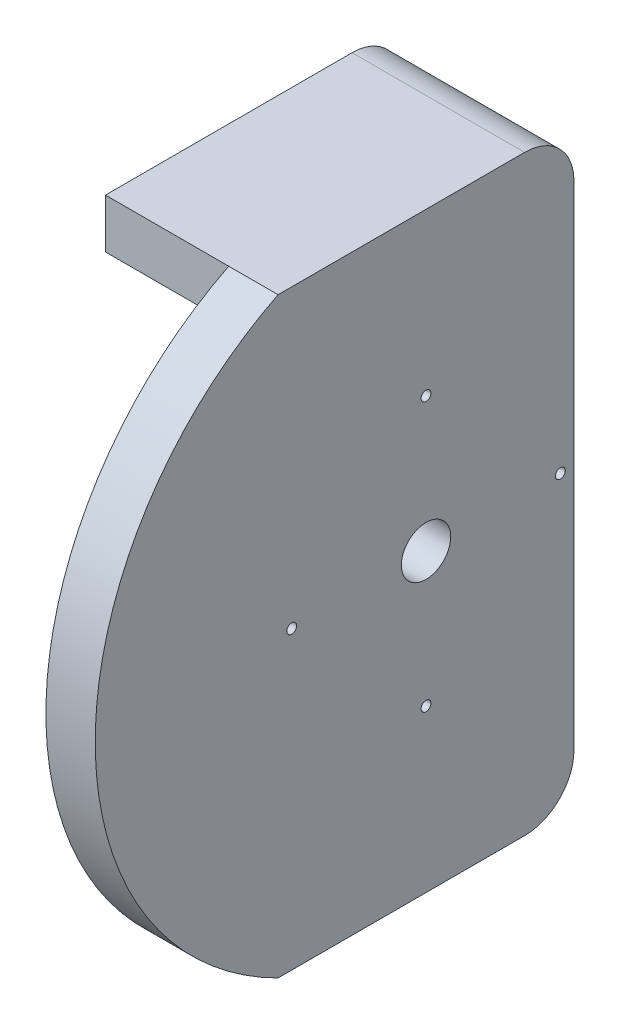
ISO-10303-21;
HEADER;
FILE_DESCRIPTION(('STEP AP214'),'2;1');
FILE_NAME('part.step','',(''),(''),'','','');
FILE_SCHEMA(('AUTOMOTIVE_DESIGN { 1 0 10303 214 1 1 1 1 }'));
ENDSEC;
DATA;
#1=APPLICATION_CONTEXT('core data for automotive mechanical design processes');
#2=APPLICATION_PROTOCOL_DEFINITION('international standard','automotive_design',2000,#1);
#3=PRODUCT_CONTEXT('',#1,'mechanical');
#4=PRODUCT('Part','Part','',(#3));
#5=PRODUCT_RELATED_PRODUCT_CATEGORY('part','',(#4));
#6=PRODUCT_DEFINITION_FORMATION('','',#4);
#7=PRODUCT_DEFINITION_CONTEXT('part definition',#1,'design');
#8=PRODUCT_DEFINITION('design','',#6,#7);
#9=PRODUCT_DEFINITION_SHAPE('','',#8);
#10=(LENGTH_UNIT() NAMED_UNIT(*) SI_UNIT(.MILLI.,.METRE.));
#11=(NAMED_UNIT(*) PLANE_ANGLE_UNIT() SI_UNIT($,.RADIAN.));
#12=(NAMED_UNIT(*) SI_UNIT($,.STERADIAN.) SOLID_ANGLE_UNIT());
#13=UNCERTAINTY_MEASURE_WITH_UNIT(LENGTH_MEASURE(1.E-05),#10,'distance_accuracy_value','');
#14=(GEOMETRIC_REPRESENTATION_CONTEXT(3) GLOBAL_UNCERTAINTY_ASSIGNED_CONTEXT((#13)) GLOBAL_UNIT_ASSIGNED_CONTEXT((#10,
#11,#12)) REPRESENTATION_CONTEXT('',''));
#15=CARTESIAN_POINT('',(0.,0.,0.));
#16=DIRECTION('',(0.,0.,1.));
#17=DIRECTION('',(1.,0.,0.));
#18=AXIS2_PLACEMENT_3D('',#15,#16,#17);
#19=CARTESIAN_POINT('',(32.5,-25.,0.));
#20=DIRECTION('',(1.,0.,0.));
#21=DIRECTION('',(0.,0.,-1.));
#22=AXIS2_PLACEMENT_3D('',#19,#20,#21);
#23=PLANE('',#22);
#24=CARTESIAN_POINT('',(32.5,-13.62,9.99999999999999));
#25=DIRECTION('',(1.,0.,0.));
#26=DIRECTION('',(0.,0.,-1.));
#27=AXIS2_PLACEMENT_3D('',#24,#25,#26);
#28=CIRCLE('',#27,0.499999999999999);
#29=CARTESIAN_POINT('',(32.5,-13.62,9.5));
#30=VERTEX_POINT('',#29);
#31=EDGE_CURVE('E471',#30,#30,#28,.F.);
#32=ORIENTED_EDGE('',*,*,#31,.F.);
#33=EDGE_LOOP('',(#32));
#34=FACE_BOUND('',#33,.T.);
#35=CARTESIAN_POINT('',(32.5,0.,10.));
#36=DIRECTION('',(1.,0.,0.));
#37=DIRECTION('',(0.,0.,-1.));
#38=AXIS2_PLACEMENT_3D('',#35,#36,#37);
#39=CIRCLE('',#38,2.5);
#40=CARTESIAN_POINT('',(32.5,0.,7.5));
#41=VERTEX_POINT('',#40);
#42=EDGE_CURVE('E368',#41,#41,#39,.T.);
#43=ORIENTED_EDGE('',*,*,#42,.T.);
#44=EDGE_LOOP('',(#43));
#45=FACE_BOUND('',#44,.T.);
#46=DIRECTION('',(0.,0.,1.));
#47=VECTOR('',#46,1.);
#48=CARTESIAN_POINT('',(32.5,-25.,0.));
#49=LINE('',#48,#47);
#50=CARTESIAN_POINT('',(32.5,-25.,0.));
#51=VERTEX_POINT('',#50);
#52=CARTESIAN_POINT('',(32.5,-25.,25.));
#53=VERTEX_POINT('',#52);
#54=EDGE_CURVE('E228',#51,#53,#49,.T.);
#55=ORIENTED_EDGE('',*,*,#54,.T.);
#56=DIRECTION('',(0.,-1.,0.));
#57=VECTOR('',#56,1.);
#58=CARTESIAN_POINT('',(32.5,30.,25.));
#59=LINE('',#58,#57);
#60=CARTESIAN_POINT('',(32.5,-30.,25.));
#61=VERTEX_POINT('',#60);
#62=EDGE_CURVE('E363',#53,#61,#59,.T.);
#63=ORIENTED_EDGE('',*,*,#62,.T.);
#64=CARTESIAN_POINT('',(32.5,0.,10.));
#65=DIRECTION('',(1.,0.,0.));
#66=DIRECTION('',(0.,0.,-1.));
#67=AXIS2_PLACEMENT_3D('',#64,#65,#66);
#68=CIRCLE('',#67,33.5410196624969);
#69=CARTESIAN_POINT('',(32.5,30.,25.));
#70=VERTEX_POINT('',#69);
#71=EDGE_CURVE('E359',#61,#70,#68,.F.);
#72=ORIENTED_EDGE('',*,*,#71,.T.);
#73=CARTESIAN_POINT('',(32.5,25.,25.));
#74=VERTEX_POINT('',#73);
#75=EDGE_CURVE('E204',#70,#74,#59,.T.);
#76=ORIENTED_EDGE('',*,*,#75,.T.);
#77=DIRECTION('',(0.,0.,1.));
#78=VECTOR('',#77,1.);
#79=CARTESIAN_POINT('',(32.5,25.,0.));
#80=LINE('',#79,#78);
#81=CARTESIAN_POINT('',(32.5,25.,0.));
#82=VERTEX_POINT('',#81);
#83=EDGE_CURVE('E229',#82,#74,#80,.T.);
#84=ORIENTED_EDGE('',*,*,#83,.F.);
#85=DIRECTION('',(0.,1.,0.));
#86=VECTOR('',#85,1.);
#87=CARTESIAN_POINT('',(32.5,-25.,0.));
#88=LINE('',#87,#86);
#89=EDGE_CURVE('E220',#51,#82,#88,.T.);
#90=ORIENTED_EDGE('',*,*,#89,.F.);
#91=EDGE_LOOP('',(#55,#63,#72,#76,#84,#90));
#92=FACE_BOUND('',#91,.T.);
#93=CARTESIAN_POINT('',(32.5,13.62,10.));
#94=DIRECTION('',(1.,0.,0.));
#95=DIRECTION('',(0.,0.,-1.));
#96=AXIS2_PLACEMENT_3D('',#93,#94,#95);
#97=CIRCLE('',#96,0.499999999999999);
#98=CARTESIAN_POINT('',(32.5,13.62,9.50000000000001));
#99=VERTEX_POINT('',#98);
#100=EDGE_CURVE('E463',#99,#99,#97,.F.);
#101=ORIENTED_EDGE('',*,*,#100,.F.);
#102=EDGE_LOOP('',(#101));
#103=FACE_BOUND('',#102,.T.);
#104=CARTESIAN_POINT('',(32.5,0.,23.62));
#105=DIRECTION('',(1.,0.,0.));
#106=DIRECTION('',(0.,0.,-1.));
#107=AXIS2_PLACEMENT_3D('',#104,#105,#106);
#108=CIRCLE('',#107,0.499999999999999);
#109=CARTESIAN_POINT('',(32.5,0.,23.12));
#110=VERTEX_POINT('',#109);
#111=EDGE_CURVE('E455',#110,#110,#108,.F.);
#112=ORIENTED_EDGE('',*,*,#111,.F.);
#113=EDGE_LOOP('',(#112));
#114=FACE_BOUND('',#113,.T.);
#115=ADVANCED_FACE('F46',(#34,#45,#92,#103,#114),#23,.F.);
#116=CARTESIAN_POINT('',(-98.3276253029822,30.,25.));
#117=DIRECTION('',(0.,0.,-1.));
#118=DIRECTION('',(0.,1.,0.));
#119=AXIS2_PLACEMENT_3D('',#116,#117,#118);
#120=PLANE('',#119);
#121=DIRECTION('',(1.,0.,0.));
#122=VECTOR('',#121,1.);
#123=CARTESIAN_POINT('',(-98.3276253029822,30.,25.));
#124=LINE('',#123,#122);
#125=CARTESIAN_POINT('',(20.,30.,25.));
#126=VERTEX_POINT('',#125);
#127=EDGE_CURVE('E195',#126,#70,#124,.T.);
#128=ORIENTED_EDGE('',*,*,#127,.F.);
#129=DIRECTION('',(0.,-1.,0.));
#130=VECTOR('',#129,1.);
#131=CARTESIAN_POINT('',(20.,30.,25.));
#132=LINE('',#131,#130);
#133=CARTESIAN_POINT('',(20.,25.,25.));
#134=VERTEX_POINT('',#133);
#135=EDGE_CURVE('E179',#126,#134,#132,.T.);
#136=ORIENTED_EDGE('',*,*,#135,.T.);
#137=DIRECTION('',(-1.,0.,0.));
#138=VECTOR('',#137,1.);
#139=CARTESIAN_POINT('',(32.5,25.,25.));
#140=LINE('',#139,#138);
#141=EDGE_CURVE('E206',#74,#134,#140,.T.);
#142=ORIENTED_EDGE('',*,*,#141,.F.);
#143=ORIENTED_EDGE('',*,*,#75,.F.);
#144=EDGE_LOOP('',(#128,#136,#142,#143));
#145=FACE_BOUND('',#144,.T.);
#146=ADVANCED_FACE('F203',(#145),#120,.F.);
#147=DIRECTION('',(1.,0.,0.));
#148=VECTOR('',#147,1.);
#149=CARTESIAN_POINT('',(32.5,-25.,25.));
#150=LINE('',#149,#148);
#151=CARTESIAN_POINT('',(20.,-25.,25.));
#152=VERTEX_POINT('',#151);
#153=EDGE_CURVE('E313',#152,#53,#150,.T.);
#154=ORIENTED_EDGE('',*,*,#153,.F.);
#155=DIRECTION('',(0.,-1.,0.));
#156=VECTOR('',#155,1.);
#157=CARTESIAN_POINT('',(20.,30.,25.));
#158=LINE('',#157,#156);
#159=CARTESIAN_POINT('',(20.,-30.,25.));
#160=VERTEX_POINT('',#159);
#161=EDGE_CURVE('E440',#152,#160,#158,.T.);
#162=ORIENTED_EDGE('',*,*,#161,.T.);
#163=DIRECTION('',(1.,0.,0.));
#164=VECTOR('',#163,1.);
#165=CARTESIAN_POINT('',(-98.3276253029822,-30.,25.));
#166=LINE('',#165,#164);
#167=EDGE_CURVE('E207',#160,#61,#166,.T.);
#168=ORIENTED_EDGE('',*,*,#167,.T.);
#169=ORIENTED_EDGE('',*,*,#62,.F.);
#170=EDGE_LOOP('',(#154,#162,#168,#169));
#171=FACE_BOUND('',#170,.T.);
#172=ADVANCED_FACE('F500',(#171),#120,.F.);
#173=CARTESIAN_POINT('',(20.,22.5,-8.));
#174=DIRECTION('',(1.,0.,0.));
#175=DIRECTION('',(0.,1.,0.));
#176=AXIS2_PLACEMENT_3D('',#173,#174,#175);
#177=PLANE('',#176);
#178=DIRECTION('',(0.,1.,0.));
#179=VECTOR('',#178,1.);
#180=CARTESIAN_POINT('',(20.,22.5,-5.));
#181=LINE('',#180,#179);
#182=CARTESIAN_POINT('',(20.,13.75,-5.));
#183=VERTEX_POINT('',#182);
#184=CARTESIAN_POINT('',(20.,25.,-5.));
#185=VERTEX_POINT('',#184);
#186=EDGE_CURVE('E213',#183,#185,#181,.T.);
#187=ORIENTED_EDGE('',*,*,#186,.F.);
#188=DIRECTION('',(0.,0.,1.));
#189=VECTOR('',#188,1.);
#190=CARTESIAN_POINT('',(20.,13.75,-8.));
#191=LINE('',#190,#189);
#192=CARTESIAN_POINT('',(20.,13.75,0.));
#193=VERTEX_POINT('',#192);
#194=EDGE_CURVE('E293',#183,#193,#191,.T.);
#195=ORIENTED_EDGE('',*,*,#194,.T.);
#196=DIRECTION('',(0.,1.,0.));
#197=VECTOR('',#196,1.);
#198=CARTESIAN_POINT('',(20.,22.5,0.));
#199=LINE('',#198,#197);
#200=CARTESIAN_POINT('',(20.,25.,0.));
#201=VERTEX_POINT('',#200);
#202=EDGE_CURVE('E296',#193,#201,#199,.T.);
#203=ORIENTED_EDGE('',*,*,#202,.T.);
#204=DIRECTION('',(0.,0.,-1.));
#205=VECTOR('',#204,1.);
#206=CARTESIAN_POINT('',(20.,25.,0.));
#207=LINE('',#206,#205);
#208=EDGE_CURVE('E183',#134,#201,#207,.T.);
#209=ORIENTED_EDGE('',*,*,#208,.F.);
#210=ORIENTED_EDGE('',*,*,#135,.F.);
#211=DIRECTION('',(0.,0.,1.));
#212=VECTOR('',#211,1.);
#213=CARTESIAN_POINT('',(20.,30.,-101.199027968231));
#214=LINE('',#213,#212);
#215=CARTESIAN_POINT('',(20.,30.,0.));
#216=VERTEX_POINT('',#215);
#217=EDGE_CURVE('E69',#216,#126,#214,.T.);
#218=ORIENTED_EDGE('',*,*,#217,.F.);
#219=CARTESIAN_POINT('',(20.,25.,0.));
#220=DIRECTION('',(1.,0.,0.));
#221=DIRECTION('',(0.,1.,0.));
#222=AXIS2_PLACEMENT_3D('',#219,#220,#221);
#223=CIRCLE('',#222,5.);
#224=EDGE_CURVE('E11',#216,#185,#223,.F.);
#225=ORIENTED_EDGE('',*,*,#224,.T.);
#226=EDGE_LOOP('',(#187,#195,#203,#209,#210,#218,#225));
#227=FACE_BOUND('',#226,.T.);
#228=ADVANCED_FACE('F181',(#227),#177,.F.);
#229=DIRECTION('',(0.,0.,1.));
#230=VECTOR('',#229,1.);
#231=CARTESIAN_POINT('',(20.,11.25,-8.));
#232=LINE('',#231,#230);
#233=CARTESIAN_POINT('',(20.,11.25,-5.));
#234=VERTEX_POINT('',#233);
#235=CARTESIAN_POINT('',(20.,11.25,0.));
#236=VERTEX_POINT('',#235);
#237=EDGE_CURVE('E292',#234,#236,#232,.T.);
#238=ORIENTED_EDGE('',*,*,#237,.F.);
#239=DIRECTION('',(0.,-1.,0.));
#240=VECTOR('',#239,1.);
#241=CARTESIAN_POINT('',(20.,-22.5,-5.));
#242=LINE('',#241,#240);
#243=CARTESIAN_POINT('',(20.,-11.25,-5.));
#244=VERTEX_POINT('',#243);
#245=EDGE_CURVE('E394',#234,#244,#242,.T.);
#246=ORIENTED_EDGE('',*,*,#245,.T.);
#247=DIRECTION('',(0.,0.,1.));
#248=VECTOR('',#247,1.);
#249=CARTESIAN_POINT('',(20.,-11.25,-8.));
#250=LINE('',#249,#248);
#251=CARTESIAN_POINT('',(20.,-11.25,0.));
#252=VERTEX_POINT('',#251);
#253=EDGE_CURVE('E259',#244,#252,#250,.T.);
#254=ORIENTED_EDGE('',*,*,#253,.T.);
#255=EDGE_CURVE('E305',#252,#236,#199,.T.);
#256=ORIENTED_EDGE('',*,*,#255,.T.);
#257=EDGE_LOOP('',(#238,#246,#254,#256));
#258=FACE_BOUND('',#257,.T.);
#259=ADVANCED_FACE('F523',(#258),#177,.F.);
#260=CARTESIAN_POINT('',(37.5,-30.,-8.));
#261=DIRECTION('',(1.,0.,0.));
#262=DIRECTION('',(0.,0.,-1.));
#263=AXIS2_PLACEMENT_3D('',#260,#261,#262);
#264=PLANE('',#263);
#265=CARTESIAN_POINT('',(37.5,0.,-3.62));
#266=DIRECTION('',(1.,0.,0.));
#267=DIRECTION('',(0.,0.,-1.));
#268=AXIS2_PLACEMENT_3D('',#265,#266,#267);
#269=CIRCLE('',#268,0.499999999999999);
#270=CARTESIAN_POINT('',(37.5,0.,-4.12));
#271=VERTEX_POINT('',#270);
#272=EDGE_CURVE('E446',#271,#271,#269,.T.);
#273=ORIENTED_EDGE('',*,*,#272,.F.);
#274=EDGE_LOOP('',(#273));
#275=FACE_BOUND('',#274,.T.);
#276=CARTESIAN_POINT('',(37.5,0.,23.62));
#277=DIRECTION('',(1.,0.,0.));
#278=DIRECTION('',(0.,0.,-1.));
#279=AXIS2_PLACEMENT_3D('',#276,#277,#278);
#280=CIRCLE('',#279,0.499999999999999);
#281=CARTESIAN_POINT('',(37.5,0.,23.12));
#282=VERTEX_POINT('',#281);
#283=EDGE_CURVE('E454',#282,#282,#280,.T.);
#284=ORIENTED_EDGE('',*,*,#283,.F.);
#285=EDGE_LOOP('',(#284));
#286=FACE_BOUND('',#285,.T.);
#287=CARTESIAN_POINT('',(37.5,13.62,10.));
#288=DIRECTION('',(1.,0.,0.));
#289=DIRECTION('',(0.,0.,-1.));
#290=AXIS2_PLACEMENT_3D('',#287,#288,#289);
#291=CIRCLE('',#290,0.499999999999999);
#292=CARTESIAN_POINT('',(37.5,13.62,9.50000000000001));
#293=VERTEX_POINT('',#292);
#294=EDGE_CURVE('E459',#293,#293,#291,.T.);
#295=ORIENTED_EDGE('',*,*,#294,.F.);
#296=EDGE_LOOP('',(#295));
#297=FACE_BOUND('',#296,.T.);
#298=CARTESIAN_POINT('',(37.5,-13.62,9.99999999999999));
#299=DIRECTION('',(1.,0.,0.));
#300=DIRECTION('',(0.,0.,-1.));
#301=AXIS2_PLACEMENT_3D('',#298,#299,#300);
#302=CIRCLE('',#301,0.499999999999999);
#303=CARTESIAN_POINT('',(37.5,-13.62,9.5));
#304=VERTEX_POINT('',#303);
#305=EDGE_CURVE('E467',#304,#304,#302,.T.);
#306=ORIENTED_EDGE('',*,*,#305,.F.);
#307=EDGE_LOOP('',(#306));
#308=FACE_BOUND('',#307,.T.);
#309=CARTESIAN_POINT('',(37.5,0.,10.));
#310=DIRECTION('',(-1.,0.,0.));
#311=DIRECTION('',(0.,0.,1.));
#312=AXIS2_PLACEMENT_3D('',#309,#310,#311);
#313=CIRCLE('',#312,2.5);
#314=CARTESIAN_POINT('',(37.5,0.,12.5));
#315=VERTEX_POINT('',#314);
#316=EDGE_CURVE('E362',#315,#315,#313,.T.);
#317=ORIENTED_EDGE('',*,*,#316,.T.);
#318=EDGE_LOOP('',(#317));
#319=FACE_BOUND('',#318,.T.);
#320=DIRECTION('',(0.,0.,1.));
#321=VECTOR('',#320,1.);
#322=CARTESIAN_POINT('',(37.5,-30.,-8.));
#323=LINE('',#322,#321);
#324=CARTESIAN_POINT('',(37.5,-30.,0.));
#325=VERTEX_POINT('',#324);
#326=CARTESIAN_POINT('',(37.5,-30.,25.));
#327=VERTEX_POINT('',#326);
#328=EDGE_CURVE('E310',#325,#327,#323,.T.);
#329=ORIENTED_EDGE('',*,*,#328,.F.);
#330=CARTESIAN_POINT('',(37.5,-25.,0.));
#331=DIRECTION('',(1.,0.,0.));
#332=DIRECTION('',(0.,0.,-1.));
#333=AXIS2_PLACEMENT_3D('',#330,#331,#332);
#334=CIRCLE('',#333,5.);
#335=CARTESIAN_POINT('',(37.5,-25.,-5.));
#336=VERTEX_POINT('',#335);
#337=EDGE_CURVE('E337',#325,#336,#334,.T.);
#338=ORIENTED_EDGE('',*,*,#337,.T.);
#339=DIRECTION('',(0.,-1.,0.));
#340=VECTOR('',#339,1.);
#341=CARTESIAN_POINT('',(37.5,30.,-5.));
#342=LINE('',#341,#340);
#343=CARTESIAN_POINT('',(37.5,25.,-5.));
#344=VERTEX_POINT('',#343);
#345=EDGE_CURVE('E324',#344,#336,#342,.T.);
#346=ORIENTED_EDGE('',*,*,#345,.F.);
#347=CARTESIAN_POINT('',(37.5,25.,0.));
#348=DIRECTION('',(1.,0.,0.));
#349=DIRECTION('',(0.,0.,-1.));
#350=AXIS2_PLACEMENT_3D('',#347,#348,#349);
#351=CIRCLE('',#350,5.);
#352=CARTESIAN_POINT('',(37.5,30.,0.));
#353=VERTEX_POINT('',#352);
#354=EDGE_CURVE('E334',#344,#353,#351,.T.);
#355=ORIENTED_EDGE('',*,*,#354,.T.);
#356=DIRECTION('',(0.,0.,1.));
#357=VECTOR('',#356,1.);
#358=CARTESIAN_POINT('',(37.5,30.,-8.));
#359=LINE('',#358,#357);
#360=CARTESIAN_POINT('',(37.5,30.,25.));
#361=VERTEX_POINT('',#360);
#362=EDGE_CURVE('E309',#353,#361,#359,.T.);
#363=ORIENTED_EDGE('',*,*,#362,.T.);
#364=CARTESIAN_POINT('',(37.5,0.,10.));
#365=DIRECTION('',(1.,0.,0.));
#366=DIRECTION('',(0.,0.,-1.));
#367=AXIS2_PLACEMENT_3D('',#364,#365,#366);
#368=CIRCLE('',#367,33.5410196624969);
#369=EDGE_CURVE('E475',#361,#327,#368,.T.);
#370=ORIENTED_EDGE('',*,*,#369,.T.);
#371=EDGE_LOOP('',(#329,#338,#346,#355,#363,#370));
#372=FACE_BOUND('',#371,.T.);
#373=ADVANCED_FACE('F428',(#275,#286,#297,#308,#319,#372),#264,.T.);
#374=CARTESIAN_POINT('',(-37.5,-30.,-8.));
#375=DIRECTION('',(0.,-1.,0.));
#376=DIRECTION('',(0.,0.,-1.));
#377=AXIS2_PLACEMENT_3D('',#374,#375,#376);
#378=PLANE('',#377);
#379=DIRECTION('',(0.,0.,1.));
#380=VECTOR('',#379,1.);
#381=CARTESIAN_POINT('',(20.,-30.,-101.199027968231));
#382=LINE('',#381,#380);
#383=CARTESIAN_POINT('',(20.,-30.,0.));
#384=VERTEX_POINT('',#383);
#385=EDGE_CURVE('E200',#384,#160,#382,.T.);
#386=ORIENTED_EDGE('',*,*,#385,.F.);
#387=DIRECTION('',(-1.,0.,0.));
#388=VECTOR('',#387,1.);
#389=CARTESIAN_POINT('',(-37.5,-30.,0.));
#390=LINE('',#389,#388);
#391=EDGE_CURVE('E331',#384,#325,#390,.F.);
#392=ORIENTED_EDGE('',*,*,#391,.T.);
#393=ORIENTED_EDGE('',*,*,#328,.T.);
#394=DIRECTION('',(1.,0.,0.));
#395=VECTOR('',#394,1.);
#396=CARTESIAN_POINT('',(-30.2994379761881,-30.,25.));
#397=LINE('',#396,#395);
#398=EDGE_CURVE('E371',#61,#327,#397,.T.);
#399=ORIENTED_EDGE('',*,*,#398,.F.);
#400=ORIENTED_EDGE('',*,*,#167,.F.);
#401=EDGE_LOOP('',(#386,#392,#393,#399,#400));
#402=FACE_BOUND('',#401,.T.);
#403=ADVANCED_FACE('F493',(#402),#378,.T.);
#404=CARTESIAN_POINT('',(-37.5,30.,-8.));
#405=DIRECTION('',(0.,1.,0.));
#406=DIRECTION('',(0.,0.,1.));
#407=AXIS2_PLACEMENT_3D('',#404,#405,#406);
#408=PLANE('',#407);
#409=ORIENTED_EDGE('',*,*,#217,.T.);
#410=ORIENTED_EDGE('',*,*,#127,.T.);
#411=DIRECTION('',(1.,0.,0.));
#412=VECTOR('',#411,1.);
#413=CARTESIAN_POINT('',(-30.2994379761881,30.,25.));
#414=LINE('',#413,#412);
#415=EDGE_CURVE('E481',#70,#361,#414,.T.);
#416=ORIENTED_EDGE('',*,*,#415,.T.);
#417=ORIENTED_EDGE('',*,*,#362,.F.);
#418=DIRECTION('',(1.,0.,0.));
#419=VECTOR('',#418,1.);
#420=CARTESIAN_POINT('',(-37.5,30.,0.));
#421=LINE('',#420,#419);
#422=EDGE_CURVE('E55',#353,#216,#421,.F.);
#423=ORIENTED_EDGE('',*,*,#422,.T.);
#424=EDGE_LOOP('',(#409,#410,#416,#417,#423));
#425=FACE_BOUND('',#424,.T.);
#426=ADVANCED_FACE('F193',(#425),#408,.T.);
#427=CARTESIAN_POINT('',(28.5,13.75,-8.));
#428=DIRECTION('',(0.,-1.,0.));
#429=DIRECTION('',(0.,0.,-1.));
#430=AXIS2_PLACEMENT_3D('',#427,#428,#429);
#431=PLANE('',#430);
#432=ORIENTED_EDGE('',*,*,#194,.F.);
#433=DIRECTION('',(1.,0.,0.));
#434=VECTOR('',#433,1.);
#435=CARTESIAN_POINT('',(28.5,13.75,-5.));
#436=LINE('',#435,#434);
#437=CARTESIAN_POINT('',(28.5,13.75,-5.));
#438=VERTEX_POINT('',#437);
#439=EDGE_CURVE('E413',#183,#438,#436,.T.);
#440=ORIENTED_EDGE('',*,*,#439,.T.);
#441=DIRECTION('',(0.,0.,1.));
#442=VECTOR('',#441,1.);
#443=CARTESIAN_POINT('',(28.5,13.75,-8.));
#444=LINE('',#443,#442);
#445=CARTESIAN_POINT('',(28.5,13.75,0.));
#446=VERTEX_POINT('',#445);
#447=EDGE_CURVE('E297',#438,#446,#444,.T.);
#448=ORIENTED_EDGE('',*,*,#447,.T.);
#449=DIRECTION('',(1.,0.,0.));
#450=VECTOR('',#449,1.);
#451=CARTESIAN_POINT('',(28.5,13.75,0.));
#452=LINE('',#451,#450);
#453=EDGE_CURVE('E288',#193,#446,#452,.T.);
#454=ORIENTED_EDGE('',*,*,#453,.F.);
#455=EDGE_LOOP('',(#432,#440,#448,#454));
#456=FACE_BOUND('',#455,.T.);
#457=ADVANCED_FACE('F530',(#456),#431,.T.);
#458=CARTESIAN_POINT('',(28.5,11.25,-8.));
#459=DIRECTION('',(-1.,0.,0.));
#460=DIRECTION('',(0.,0.,1.));
#461=AXIS2_PLACEMENT_3D('',#458,#459,#460);
#462=PLANE('',#461);
#463=ORIENTED_EDGE('',*,*,#447,.F.);
#464=DIRECTION('',(0.,-1.,0.));
#465=VECTOR('',#464,1.);
#466=CARTESIAN_POINT('',(28.5,11.25,-5.));
#467=LINE('',#466,#465);
#468=CARTESIAN_POINT('',(28.5,11.25,-5.));
#469=VERTEX_POINT('',#468);
#470=EDGE_CURVE('E410',#438,#469,#467,.T.);
#471=ORIENTED_EDGE('',*,*,#470,.T.);
#472=DIRECTION('',(0.,0.,1.));
#473=VECTOR('',#472,1.);
#474=CARTESIAN_POINT('',(28.5,11.25,-8.));
#475=LINE('',#474,#473);
#476=CARTESIAN_POINT('',(28.5,11.25,0.));
#477=VERTEX_POINT('',#476);
#478=EDGE_CURVE('E300',#469,#477,#475,.T.);
#479=ORIENTED_EDGE('',*,*,#478,.T.);
#480=DIRECTION('',(0.,-1.,0.));
#481=VECTOR('',#480,1.);
#482=CARTESIAN_POINT('',(28.5,11.25,0.));
#483=LINE('',#482,#481);
#484=EDGE_CURVE('E284',#446,#477,#483,.T.);
#485=ORIENTED_EDGE('',*,*,#484,.F.);
#486=EDGE_LOOP('',(#463,#471,#479,#485));
#487=FACE_BOUND('',#486,.T.);
#488=ADVANCED_FACE('F529',(#487),#462,.T.);
#489=CARTESIAN_POINT('',(20.,11.25,-8.));
#490=DIRECTION('',(0.,1.,0.));
#491=DIRECTION('',(0.,0.,1.));
#492=AXIS2_PLACEMENT_3D('',#489,#490,#491);
#493=PLANE('',#492);
#494=ORIENTED_EDGE('',*,*,#478,.F.);
#495=DIRECTION('',(-1.,0.,0.));
#496=VECTOR('',#495,1.);
#497=CARTESIAN_POINT('',(20.,11.25,-5.));
#498=LINE('',#497,#496);
#499=EDGE_CURVE('E406',#469,#234,#498,.T.);
#500=ORIENTED_EDGE('',*,*,#499,.T.);
#501=ORIENTED_EDGE('',*,*,#237,.T.);
#502=DIRECTION('',(-1.,0.,0.));
#503=VECTOR('',#502,1.);
#504=CARTESIAN_POINT('',(20.,11.25,0.));
#505=LINE('',#504,#503);
#506=EDGE_CURVE('E274',#477,#236,#505,.T.);
#507=ORIENTED_EDGE('',*,*,#506,.F.);
#508=EDGE_LOOP('',(#494,#500,#501,#507));
#509=FACE_BOUND('',#508,.T.);
#510=ADVANCED_FACE('F526',(#509),#493,.T.);
#511=CARTESIAN_POINT('',(24.,7.5,-8.));
#512=DIRECTION('',(0.,0.,1.));
#513=DIRECTION('',(1.,0.,0.));
#514=AXIS2_PLACEMENT_3D('',#511,#512,#513);
#515=CYLINDRICAL_SURFACE('',#514,2.7);
#516=CARTESIAN_POINT('',(24.,7.5,0.));
#517=DIRECTION('',(0.,0.,-1.));
#518=DIRECTION('',(-1.,0.,0.));
#519=AXIS2_PLACEMENT_3D('',#516,#517,#518);
#520=CIRCLE('',#519,2.7);
#521=CARTESIAN_POINT('',(21.3,7.5,0.));
#522=VERTEX_POINT('',#521);
#523=EDGE_CURVE('E233',#522,#522,#520,.T.);
#524=ORIENTED_EDGE('',*,*,#523,.F.);
#525=EDGE_LOOP('',(#524));
#526=FACE_BOUND('',#525,.T.);
#527=CARTESIAN_POINT('',(24.,7.5,-5.));
#528=DIRECTION('',(0.,0.,-1.));
#529=DIRECTION('',(-1.,0.,0.));
#530=AXIS2_PLACEMENT_3D('',#527,#528,#529);
#531=CIRCLE('',#530,2.7);
#532=CARTESIAN_POINT('',(21.3,7.5,-5.));
#533=VERTEX_POINT('',#532);
#534=EDGE_CURVE('E402',#533,#533,#531,.T.);
#535=ORIENTED_EDGE('',*,*,#534,.T.);
#536=EDGE_LOOP('',(#535));
#537=FACE_BOUND('',#536,.T.);
#538=ADVANCED_FACE('F574',(#526,#537),#515,.F.);
#539=CARTESIAN_POINT('',(24.,17.5,-8.));
#540=DIRECTION('',(0.,0.,1.));
#541=DIRECTION('',(1.,0.,0.));
#542=AXIS2_PLACEMENT_3D('',#539,#540,#541);
#543=CYLINDRICAL_SURFACE('',#542,2.7);
#544=CARTESIAN_POINT('',(24.,17.5,0.));
#545=DIRECTION('',(0.,0.,-1.));
#546=DIRECTION('',(-1.,0.,0.));
#547=AXIS2_PLACEMENT_3D('',#544,#545,#546);
#548=CIRCLE('',#547,2.7);
#549=CARTESIAN_POINT('',(21.3,17.5,0.));
#550=VERTEX_POINT('',#549);
#551=EDGE_CURVE('E246',#550,#550,#548,.T.);
#552=ORIENTED_EDGE('',*,*,#551,.F.);
#553=EDGE_LOOP('',(#552));
#554=FACE_BOUND('',#553,.T.);
#555=CARTESIAN_POINT('',(24.,17.5,-5.));
#556=DIRECTION('',(0.,0.,-1.));
#557=DIRECTION('',(-1.,0.,0.));
#558=AXIS2_PLACEMENT_3D('',#555,#556,#557);
#559=CIRCLE('',#558,2.7);
#560=CARTESIAN_POINT('',(21.3,17.5,-5.));
#561=VERTEX_POINT('',#560);
#562=EDGE_CURVE('E398',#561,#561,#559,.T.);
#563=ORIENTED_EDGE('',*,*,#562,.T.);
#564=EDGE_LOOP('',(#563));
#565=FACE_BOUND('',#564,.T.);
#566=ADVANCED_FACE('F572',(#554,#565),#543,.F.);
#567=CARTESIAN_POINT('',(20.,-22.5,-8.));
#568=DIRECTION('',(-1.,0.,0.));
#569=DIRECTION('',(0.,-1.,0.));
#570=AXIS2_PLACEMENT_3D('',#567,#568,#569);
#571=PLANE('',#570);
#572=DIRECTION('',(0.,0.,1.));
#573=VECTOR('',#572,1.);
#574=CARTESIAN_POINT('',(20.,-13.75,-8.));
#575=LINE('',#574,#573);
#576=CARTESIAN_POINT('',(20.,-13.75,-5.));
#577=VERTEX_POINT('',#576);
#578=CARTESIAN_POINT('',(20.,-13.75,0.));
#579=VERTEX_POINT('',#578);
#580=EDGE_CURVE('E258',#577,#579,#575,.T.);
#581=ORIENTED_EDGE('',*,*,#580,.F.);
#582=DIRECTION('',(0.,-1.,0.));
#583=VECTOR('',#582,1.);
#584=CARTESIAN_POINT('',(20.,-22.5,-5.));
#585=LINE('',#584,#583);
#586=CARTESIAN_POINT('',(20.,-25.,-5.));
#587=VERTEX_POINT('',#586);
#588=EDGE_CURVE('E62',#577,#587,#585,.T.);
#589=ORIENTED_EDGE('',*,*,#588,.T.);
#590=CARTESIAN_POINT('',(20.,-25.,0.));
#591=DIRECTION('',(1.,0.,0.));
#592=DIRECTION('',(0.,1.,0.));
#593=AXIS2_PLACEMENT_3D('',#590,#591,#592);
#594=CIRCLE('',#593,5.);
#595=EDGE_CURVE('E189',#587,#384,#594,.F.);
#596=ORIENTED_EDGE('',*,*,#595,.T.);
#597=ORIENTED_EDGE('',*,*,#385,.T.);
#598=ORIENTED_EDGE('',*,*,#161,.F.);
#599=DIRECTION('',(0.,0.,1.));
#600=VECTOR('',#599,1.);
#601=CARTESIAN_POINT('',(20.,-25.,0.));
#602=LINE('',#601,#600);
#603=CARTESIAN_POINT('',(20.,-25.,0.));
#604=VERTEX_POINT('',#603);
#605=EDGE_CURVE('E436',#604,#152,#602,.T.);
#606=ORIENTED_EDGE('',*,*,#605,.F.);
#607=DIRECTION('',(0.,-1.,0.));
#608=VECTOR('',#607,1.);
#609=CARTESIAN_POINT('',(20.,-22.5,0.));
#610=LINE('',#609,#608);
#611=EDGE_CURVE('E263',#579,#604,#610,.T.);
#612=ORIENTED_EDGE('',*,*,#611,.F.);
#613=EDGE_LOOP('',(#581,#589,#596,#597,#598,#606,#612));
#614=FACE_BOUND('',#613,.T.);
#615=ADVANCED_FACE('F496',(#614),#571,.T.);
#616=CARTESIAN_POINT('',(20.,-11.25,-8.));
#617=DIRECTION('',(0.,1.,0.));
#618=DIRECTION('',(0.,0.,1.));
#619=AXIS2_PLACEMENT_3D('',#616,#617,#618);
#620=PLANE('',#619);
#621=DIRECTION('',(-1.,0.,0.));
#622=VECTOR('',#621,1.);
#623=CARTESIAN_POINT('',(20.,-11.25,-5.));
#624=LINE('',#623,#622);
#625=CARTESIAN_POINT('',(28.5,-11.25,-5.));
#626=VERTEX_POINT('',#625);
#627=EDGE_CURVE('E389',#626,#244,#624,.T.);
#628=ORIENTED_EDGE('',*,*,#627,.F.);
#629=DIRECTION('',(0.,0.,1.));
#630=VECTOR('',#629,1.);
#631=CARTESIAN_POINT('',(28.5,-11.25,-8.));
#632=LINE('',#631,#630);
#633=CARTESIAN_POINT('',(28.5,-11.25,0.));
#634=VERTEX_POINT('',#633);
#635=EDGE_CURVE('E264',#626,#634,#632,.T.);
#636=ORIENTED_EDGE('',*,*,#635,.T.);
#637=DIRECTION('',(-1.,0.,0.));
#638=VECTOR('',#637,1.);
#639=CARTESIAN_POINT('',(20.,-11.25,0.));
#640=LINE('',#639,#638);
#641=EDGE_CURVE('E254',#634,#252,#640,.T.);
#642=ORIENTED_EDGE('',*,*,#641,.T.);
#643=ORIENTED_EDGE('',*,*,#253,.F.);
#644=EDGE_LOOP('',(#628,#636,#642,#643));
#645=FACE_BOUND('',#644,.T.);
#646=ADVANCED_FACE('F518',(#645),#620,.F.);
#647=CARTESIAN_POINT('',(28.5,-11.25,-8.));
#648=DIRECTION('',(1.,0.,0.));
#649=DIRECTION('',(0.,0.,-1.));
#650=AXIS2_PLACEMENT_3D('',#647,#648,#649);
#651=PLANE('',#650);
#652=DIRECTION('',(0.,1.,0.));
#653=VECTOR('',#652,1.);
#654=CARTESIAN_POINT('',(28.5,-11.25,-5.));
#655=LINE('',#654,#653);
#656=CARTESIAN_POINT('',(28.5,-13.75,-5.));
#657=VERTEX_POINT('',#656);
#658=EDGE_CURVE('E386',#657,#626,#655,.T.);
#659=ORIENTED_EDGE('',*,*,#658,.F.);
#660=DIRECTION('',(0.,0.,1.));
#661=VECTOR('',#660,1.);
#662=CARTESIAN_POINT('',(28.5,-13.75,-8.));
#663=LINE('',#662,#661);
#664=CARTESIAN_POINT('',(28.5,-13.75,0.));
#665=VERTEX_POINT('',#664);
#666=EDGE_CURVE('E267',#657,#665,#663,.T.);
#667=ORIENTED_EDGE('',*,*,#666,.T.);
#668=DIRECTION('',(0.,1.,0.));
#669=VECTOR('',#668,1.);
#670=CARTESIAN_POINT('',(28.5,-11.25,0.));
#671=LINE('',#670,#669);
#672=EDGE_CURVE('E250',#665,#634,#671,.T.);
#673=ORIENTED_EDGE('',*,*,#672,.T.);
#674=ORIENTED_EDGE('',*,*,#635,.F.);
#675=EDGE_LOOP('',(#659,#667,#673,#674));
#676=FACE_BOUND('',#675,.T.);
#677=ADVANCED_FACE('F516',(#676),#651,.F.);
#678=CARTESIAN_POINT('',(28.5,-13.75,-8.));
#679=DIRECTION('',(0.,-1.,0.));
#680=DIRECTION('',(0.,0.,-1.));
#681=AXIS2_PLACEMENT_3D('',#678,#679,#680);
#682=PLANE('',#681);
#683=DIRECTION('',(1.,0.,0.));
#684=VECTOR('',#683,1.);
#685=CARTESIAN_POINT('',(28.5,-13.75,-5.));
#686=LINE('',#685,#684);
#687=EDGE_CURVE('E383',#577,#657,#686,.T.);
#688=ORIENTED_EDGE('',*,*,#687,.F.);
#689=ORIENTED_EDGE('',*,*,#580,.T.);
#690=DIRECTION('',(1.,0.,0.));
#691=VECTOR('',#690,1.);
#692=CARTESIAN_POINT('',(28.5,-13.75,0.));
#693=LINE('',#692,#691);
#694=EDGE_CURVE('E241',#579,#665,#693,.T.);
#695=ORIENTED_EDGE('',*,*,#694,.T.);
#696=ORIENTED_EDGE('',*,*,#666,.F.);
#697=EDGE_LOOP('',(#688,#689,#695,#696));
#698=FACE_BOUND('',#697,.T.);
#699=ADVANCED_FACE('F511',(#698),#682,.F.);
#700=CARTESIAN_POINT('',(24.,-7.5,-8.));
#701=DIRECTION('',(0.,0.,1.));
#702=DIRECTION('',(1.,0.,0.));
#703=AXIS2_PLACEMENT_3D('',#700,#701,#702);
#704=CYLINDRICAL_SURFACE('',#703,2.7);
#705=CARTESIAN_POINT('',(24.,-7.5,0.));
#706=DIRECTION('',(0.,0.,1.));
#707=DIRECTION('',(1.,0.,0.));
#708=AXIS2_PLACEMENT_3D('',#705,#706,#707);
#709=CIRCLE('',#708,2.7);
#710=CARTESIAN_POINT('',(26.7,-7.5,0.));
#711=VERTEX_POINT('',#710);
#712=EDGE_CURVE('E242',#711,#711,#709,.F.);
#713=ORIENTED_EDGE('',*,*,#712,.F.);
#714=EDGE_LOOP('',(#713));
#715=FACE_BOUND('',#714,.T.);
#716=CARTESIAN_POINT('',(24.,-7.5,-5.));
#717=DIRECTION('',(0.,0.,-1.));
#718=DIRECTION('',(-1.,0.,0.));
#719=AXIS2_PLACEMENT_3D('',#716,#717,#718);
#720=CIRCLE('',#719,2.7);
#721=CARTESIAN_POINT('',(21.3,-7.5,-5.));
#722=VERTEX_POINT('',#721);
#723=EDGE_CURVE('E323',#722,#722,#720,.F.);
#724=ORIENTED_EDGE('',*,*,#723,.F.);
#725=EDGE_LOOP('',(#724));
#726=FACE_BOUND('',#725,.T.);
#727=ADVANCED_FACE('F559',(#715,#726),#704,.F.);
#728=CARTESIAN_POINT('',(24.,-17.5,-8.));
#729=DIRECTION('',(0.,0.,1.));
#730=DIRECTION('',(1.,0.,0.));
#731=AXIS2_PLACEMENT_3D('',#728,#729,#730);
#732=CYLINDRICAL_SURFACE('',#731,2.7);
#733=CARTESIAN_POINT('',(24.,-17.5,0.));
#734=DIRECTION('',(0.,0.,1.));
#735=DIRECTION('',(1.,0.,0.));
#736=AXIS2_PLACEMENT_3D('',#733,#734,#735);
#737=CIRCLE('',#736,2.7);
#738=CARTESIAN_POINT('',(26.7,-17.5,0.));
#739=VERTEX_POINT('',#738);
#740=EDGE_CURVE('E237',#739,#739,#737,.F.);
#741=ORIENTED_EDGE('',*,*,#740,.F.);
#742=EDGE_LOOP('',(#741));
#743=FACE_BOUND('',#742,.T.);
#744=CARTESIAN_POINT('',(24.,-17.5,-5.));
#745=DIRECTION('',(0.,0.,-1.));
#746=DIRECTION('',(-1.,0.,0.));
#747=AXIS2_PLACEMENT_3D('',#744,#745,#746);
#748=CIRCLE('',#747,2.7);
#749=CARTESIAN_POINT('',(21.3,-17.5,-5.));
#750=VERTEX_POINT('',#749);
#751=EDGE_CURVE('E319',#750,#750,#748,.F.);
#752=ORIENTED_EDGE('',*,*,#751,.F.);
#753=EDGE_LOOP('',(#752));
#754=FACE_BOUND('',#753,.T.);
#755=ADVANCED_FACE('F556',(#743,#754),#732,.F.);
#756=CARTESIAN_POINT('',(0.,0.,0.));
#757=DIRECTION('',(0.,0.,1.));
#758=DIRECTION('',(1.,0.,0.));
#759=AXIS2_PLACEMENT_3D('',#756,#757,#758);
#760=PLANE('',#759);
#761=ORIENTED_EDGE('',*,*,#611,.T.);
#762=DIRECTION('',(1.,0.,0.));
#763=VECTOR('',#762,1.);
#764=CARTESIAN_POINT('',(32.5,-25.,0.));
#765=LINE('',#764,#763);
#766=EDGE_CURVE('E211',#604,#51,#765,.T.);
#767=ORIENTED_EDGE('',*,*,#766,.T.);
#768=ORIENTED_EDGE('',*,*,#89,.T.);
#769=DIRECTION('',(-1.,0.,0.));
#770=VECTOR('',#769,1.);
#771=CARTESIAN_POINT('',(32.5,25.,0.));
#772=LINE('',#771,#770);
#773=EDGE_CURVE('E224',#82,#201,#772,.T.);
#774=ORIENTED_EDGE('',*,*,#773,.T.);
#775=ORIENTED_EDGE('',*,*,#202,.F.);
#776=ORIENTED_EDGE('',*,*,#453,.T.);
#777=ORIENTED_EDGE('',*,*,#484,.T.);
#778=ORIENTED_EDGE('',*,*,#506,.T.);
#779=ORIENTED_EDGE('',*,*,#255,.F.);
#780=ORIENTED_EDGE('',*,*,#641,.F.);
#781=ORIENTED_EDGE('',*,*,#672,.F.);
#782=ORIENTED_EDGE('',*,*,#694,.F.);
#783=EDGE_LOOP('',(#761,#767,#768,#774,#775,#776,#777,#778,#779,#780,#781,#782));
#784=FACE_BOUND('',#783,.T.);
#785=ORIENTED_EDGE('',*,*,#551,.T.);
#786=EDGE_LOOP('',(#785));
#787=FACE_BOUND('',#786,.T.);
#788=ORIENTED_EDGE('',*,*,#523,.T.);
#789=EDGE_LOOP('',(#788));
#790=FACE_BOUND('',#789,.T.);
#791=ORIENTED_EDGE('',*,*,#712,.T.);
#792=EDGE_LOOP('',(#791));
#793=FACE_BOUND('',#792,.T.);
#794=ORIENTED_EDGE('',*,*,#740,.T.);
#795=EDGE_LOOP('',(#794));
#796=FACE_BOUND('',#795,.T.);
#797=ADVANCED_FACE('F350',(#784,#787,#790,#793,#796),#760,.T.);
#798=CARTESIAN_POINT('',(32.5,25.,0.));
#799=DIRECTION('',(0.,1.,0.));
#800=DIRECTION('',(0.,0.,1.));
#801=AXIS2_PLACEMENT_3D('',#798,#799,#800);
#802=PLANE('',#801);
#803=ORIENTED_EDGE('',*,*,#141,.T.);
#804=ORIENTED_EDGE('',*,*,#208,.T.);
#805=ORIENTED_EDGE('',*,*,#773,.F.);
#806=ORIENTED_EDGE('',*,*,#83,.T.);
#807=EDGE_LOOP('',(#803,#804,#805,#806));
#808=FACE_BOUND('',#807,.T.);
#809=ADVANCED_FACE('F347',(#808),#802,.F.);
#810=CARTESIAN_POINT('',(32.5,-25.,0.));
#811=DIRECTION('',(0.,-1.,0.));
#812=DIRECTION('',(0.,0.,-1.));
#813=AXIS2_PLACEMENT_3D('',#810,#811,#812);
#814=PLANE('',#813);
#815=ORIENTED_EDGE('',*,*,#766,.F.);
#816=ORIENTED_EDGE('',*,*,#605,.T.);
#817=ORIENTED_EDGE('',*,*,#153,.T.);
#818=ORIENTED_EDGE('',*,*,#54,.F.);
#819=EDGE_LOOP('',(#815,#816,#817,#818));
#820=FACE_BOUND('',#819,.T.);
#821=ADVANCED_FACE('F503',(#820),#814,.F.);
#822=CARTESIAN_POINT('',(0.,0.,-5.));
#823=DIRECTION('',(0.,0.,-1.));
#824=DIRECTION('',(-1.,0.,0.));
#825=AXIS2_PLACEMENT_3D('',#822,#823,#824);
#826=PLANE('',#825);
#827=ORIENTED_EDGE('',*,*,#186,.T.);
#828=DIRECTION('',(1.,0.,0.));
#829=VECTOR('',#828,1.);
#830=CARTESIAN_POINT('',(0.,25.,-5.));
#831=LINE('',#830,#829);
#832=EDGE_CURVE('E318',#185,#344,#831,.T.);
#833=ORIENTED_EDGE('',*,*,#832,.T.);
#834=ORIENTED_EDGE('',*,*,#345,.T.);
#835=DIRECTION('',(-1.,0.,0.));
#836=VECTOR('',#835,1.);
#837=CARTESIAN_POINT('',(0.,-25.,-5.));
#838=LINE('',#837,#836);
#839=EDGE_CURVE('E327',#336,#587,#838,.T.);
#840=ORIENTED_EDGE('',*,*,#839,.T.);
#841=ORIENTED_EDGE('',*,*,#588,.F.);
#842=ORIENTED_EDGE('',*,*,#687,.T.);
#843=ORIENTED_EDGE('',*,*,#658,.T.);
#844=ORIENTED_EDGE('',*,*,#627,.T.);
#845=ORIENTED_EDGE('',*,*,#245,.F.);
#846=ORIENTED_EDGE('',*,*,#499,.F.);
#847=ORIENTED_EDGE('',*,*,#470,.F.);
#848=ORIENTED_EDGE('',*,*,#439,.F.);
#849=EDGE_LOOP('',(#827,#833,#834,#840,#841,#842,#843,#844,#845,#846,#847,#848));
#850=FACE_BOUND('',#849,.T.);
#851=ORIENTED_EDGE('',*,*,#723,.T.);
#852=EDGE_LOOP('',(#851));
#853=FACE_BOUND('',#852,.T.);
#854=ORIENTED_EDGE('',*,*,#751,.T.);
#855=EDGE_LOOP('',(#854));
#856=FACE_BOUND('',#855,.T.);
#857=ORIENTED_EDGE('',*,*,#562,.F.);
#858=EDGE_LOOP('',(#857));
#859=FACE_BOUND('',#858,.T.);
#860=ORIENTED_EDGE('',*,*,#534,.F.);
#861=EDGE_LOOP('',(#860));
#862=FACE_BOUND('',#861,.T.);
#863=ADVANCED_FACE('F420',(#850,#853,#856,#859,#862),#826,.T.);
#864=CARTESIAN_POINT('',(37.5,0.,10.));
#865=DIRECTION('',(-1.,0.,0.));
#866=DIRECTION('',(0.,0.,1.));
#867=AXIS2_PLACEMENT_3D('',#864,#865,#866);
#868=CYLINDRICAL_SURFACE('',#867,2.5);
#869=ORIENTED_EDGE('',*,*,#316,.F.);
#870=EDGE_LOOP('',(#869));
#871=FACE_BOUND('',#870,.T.);
#872=ORIENTED_EDGE('',*,*,#42,.F.);
#873=EDGE_LOOP('',(#872));
#874=FACE_BOUND('',#873,.T.);
#875=ADVANCED_FACE('F587',(#871,#874),#868,.F.);
#876=CARTESIAN_POINT('',(-30.2994379761881,0.,10.));
#877=DIRECTION('',(1.,0.,0.));
#878=DIRECTION('',(0.,0.,-1.));
#879=AXIS2_PLACEMENT_3D('',#876,#877,#878);
#880=CYLINDRICAL_SURFACE('',#879,33.5410196624969);
#881=ORIENTED_EDGE('',*,*,#71,.F.);
#882=ORIENTED_EDGE('',*,*,#398,.T.);
#883=ORIENTED_EDGE('',*,*,#369,.F.);
#884=ORIENTED_EDGE('',*,*,#415,.F.);
#885=EDGE_LOOP('',(#881,#882,#883,#884));
#886=FACE_BOUND('',#885,.T.);
#887=ADVANCED_FACE('F490',(#886),#880,.T.);
#888=CARTESIAN_POINT('',(0.,-25.,0.));
#889=DIRECTION('',(-1.,0.,0.));
#890=DIRECTION('',(0.,0.,1.));
#891=AXIS2_PLACEMENT_3D('',#888,#889,#890);
#892=CYLINDRICAL_SURFACE('',#891,5.);
#893=ORIENTED_EDGE('',*,*,#595,.F.);
#894=ORIENTED_EDGE('',*,*,#839,.F.);
#895=ORIENTED_EDGE('',*,*,#337,.F.);
#896=ORIENTED_EDGE('',*,*,#391,.F.);
#897=EDGE_LOOP('',(#893,#894,#895,#896));
#898=FACE_BOUND('',#897,.T.);
#899=ADVANCED_FACE('F432',(#898),#892,.T.);
#900=CARTESIAN_POINT('',(0.,25.,0.));
#901=DIRECTION('',(1.,0.,0.));
#902=DIRECTION('',(0.,0.,-1.));
#903=AXIS2_PLACEMENT_3D('',#900,#901,#902);
#904=CYLINDRICAL_SURFACE('',#903,5.);
#905=ORIENTED_EDGE('',*,*,#224,.F.);
#906=ORIENTED_EDGE('',*,*,#422,.F.);
#907=ORIENTED_EDGE('',*,*,#354,.F.);
#908=ORIENTED_EDGE('',*,*,#832,.F.);
#909=EDGE_LOOP('',(#905,#906,#907,#908));
#910=FACE_BOUND('',#909,.T.);
#911=ADVANCED_FACE('F48',(#910),#904,.T.);
#912=CARTESIAN_POINT('',(37.5,-13.62,9.99999999999999));
#913=DIRECTION('',(1.,0.,0.));
#914=DIRECTION('',(0.,0.,-1.));
#915=AXIS2_PLACEMENT_3D('',#912,#913,#914);
#916=CYLINDRICAL_SURFACE('',#915,0.499999999999999);
#917=ORIENTED_EDGE('',*,*,#31,.T.);
#918=EDGE_LOOP('',(#917));
#919=FACE_BOUND('',#918,.T.);
#920=ORIENTED_EDGE('',*,*,#305,.T.);
#921=EDGE_LOOP('',(#920));
#922=FACE_BOUND('',#921,.T.);
#923=ADVANCED_FACE('F772',(#919,#922),#916,.F.);
#924=CARTESIAN_POINT('',(37.5,13.62,10.));
#925=DIRECTION('',(1.,0.,0.));
#926=DIRECTION('',(0.,0.,-1.));
#927=AXIS2_PLACEMENT_3D('',#924,#925,#926);
#928=CYLINDRICAL_SURFACE('',#927,0.499999999999999);
#929=ORIENTED_EDGE('',*,*,#100,.T.);
#930=EDGE_LOOP('',(#929));
#931=FACE_BOUND('',#930,.T.);
#932=ORIENTED_EDGE('',*,*,#294,.T.);
#933=EDGE_LOOP('',(#932));
#934=FACE_BOUND('',#933,.T.);
#935=ADVANCED_FACE('F777',(#931,#934),#928,.F.);
#936=CARTESIAN_POINT('',(37.5,0.,23.62));
#937=DIRECTION('',(1.,0.,0.));
#938=DIRECTION('',(0.,0.,-1.));
#939=AXIS2_PLACEMENT_3D('',#936,#937,#938);
#940=CYLINDRICAL_SURFACE('',#939,0.499999999999999);
#941=ORIENTED_EDGE('',*,*,#111,.T.);
#942=EDGE_LOOP('',(#941));
#943=FACE_BOUND('',#942,.T.);
#944=ORIENTED_EDGE('',*,*,#283,.T.);
#945=EDGE_LOOP('',(#944));
#946=FACE_BOUND('',#945,.T.);
#947=ADVANCED_FACE('F788',(#943,#946),#940,.F.);
#948=CARTESIAN_POINT('',(32.5,0.,-3.62));
#949=DIRECTION('',(1.,0.,0.));
#950=DIRECTION('',(0.,0.,-1.));
#951=AXIS2_PLACEMENT_3D('',#948,#949,#950);
#952=CONICAL_SURFACE('',#951,0.499999999999999,1.02974425867665);
#953=CARTESIAN_POINT('',(32.1995696904862,0.,-3.62));
#954=VERTEX_POINT('',#953);
#955=VERTEX_LOOP('',#954);
#956=FACE_BOUND('',#955,.T.);
#957=CARTESIAN_POINT('',(32.5,0.,-3.62));
#958=DIRECTION('',(1.,0.,0.));
#959=DIRECTION('',(0.,0.,-1.));
#960=AXIS2_PLACEMENT_3D('',#957,#958,#959);
#961=CIRCLE('',#960,0.499999999999999);
#962=CARTESIAN_POINT('',(32.5,0.,-4.12));
#963=VERTEX_POINT('',#962);
#964=EDGE_CURVE('E450',#963,#963,#961,.T.);
#965=ORIENTED_EDGE('',*,*,#964,.T.);
#966=EDGE_LOOP('',(#965));
#967=FACE_BOUND('',#966,.T.);
#968=ADVANCED_FACE('F797',(#956,#967),#952,.F.);
#969=CARTESIAN_POINT('',(37.5,0.,-3.62));
#970=DIRECTION('',(1.,0.,0.));
#971=DIRECTION('',(0.,0.,-1.));
#972=AXIS2_PLACEMENT_3D('',#969,#970,#971);
#973=CYLINDRICAL_SURFACE('',#972,0.499999999999999);
#974=ORIENTED_EDGE('',*,*,#964,.F.);
#975=EDGE_LOOP('',(#974));
#976=FACE_BOUND('',#975,.T.);
#977=ORIENTED_EDGE('',*,*,#272,.T.);
#978=EDGE_LOOP('',(#977));
#979=FACE_BOUND('',#978,.T.);
#980=ADVANCED_FACE('F744',(#976,#979),#973,.F.);
#981=CLOSED_SHELL('',(#115,#146,#172,#228,#259,#373,#403,#426,#457,#488,#510,#538,#566,#615,
#646,#677,#699,#727,#755,#797,#809,#821,#863,#875,#887,#899,#911,#923,#935,#947,#968,#980));
#982=MANIFOLD_SOLID_BREP('B2',#981);
#983=ADVANCED_BREP_SHAPE_REPRESENTATION('',(#18,#982),#14);
#984=SHAPE_DEFINITION_REPRESENTATION(#9,#983);
ENDSEC;
END-ISO-10303-21;
